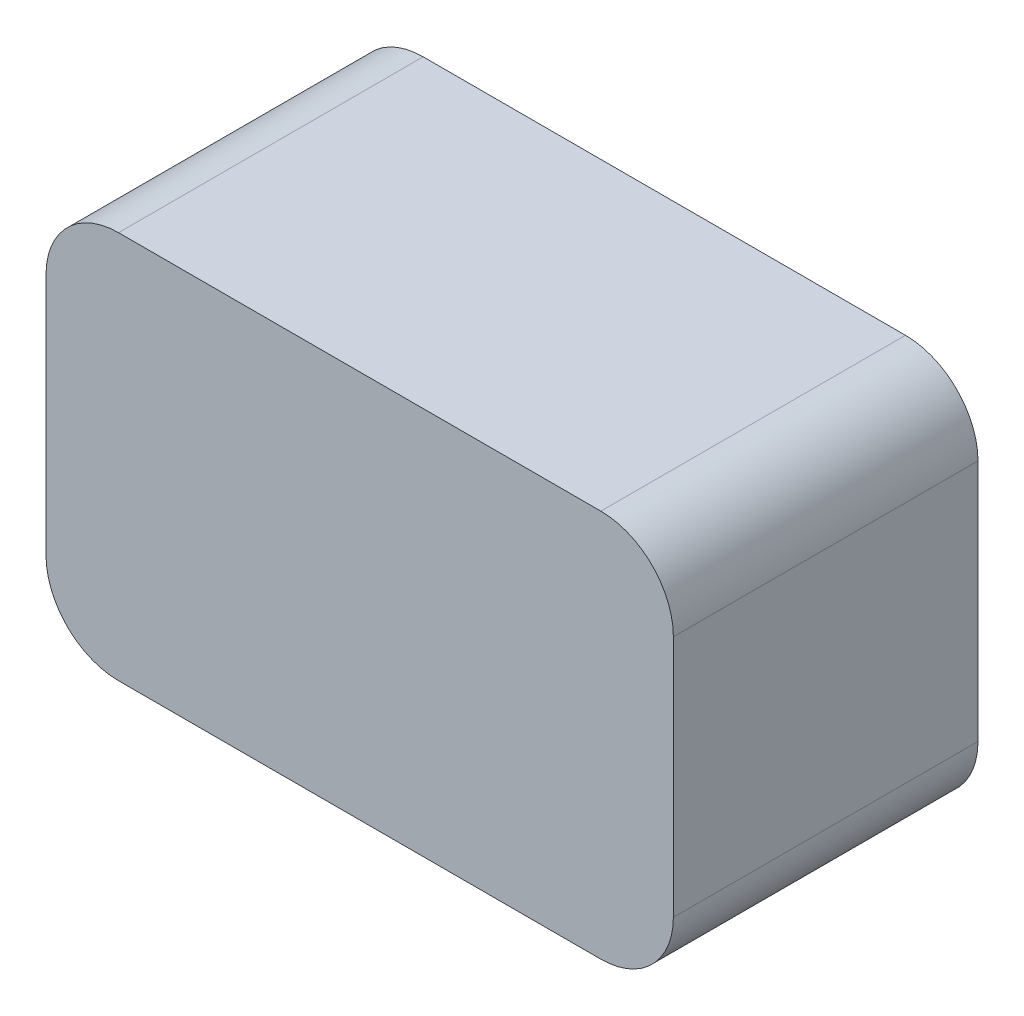
ISO-10303-21;
HEADER;
FILE_DESCRIPTION(('STEP AP214'),'2;1');
FILE_NAME('part.step','',(''),(''),'','','');
FILE_SCHEMA(('AUTOMOTIVE_DESIGN { 1 0 10303 214 1 1 1 1 }'));
ENDSEC;
DATA;
#1=APPLICATION_CONTEXT('core data for automotive mechanical design processes');
#2=APPLICATION_PROTOCOL_DEFINITION('international standard','automotive_design',2000,#1);
#3=PRODUCT_CONTEXT('',#1,'mechanical');
#4=PRODUCT('Part','Part','',(#3));
#5=PRODUCT_RELATED_PRODUCT_CATEGORY('part','',(#4));
#6=PRODUCT_DEFINITION_FORMATION('','',#4);
#7=PRODUCT_DEFINITION_CONTEXT('part definition',#1,'design');
#8=PRODUCT_DEFINITION('design','',#6,#7);
#9=PRODUCT_DEFINITION_SHAPE('','',#8);
#10=(LENGTH_UNIT() NAMED_UNIT(*) SI_UNIT(.MILLI.,.METRE.));
#11=(NAMED_UNIT(*) PLANE_ANGLE_UNIT() SI_UNIT($,.RADIAN.));
#12=(NAMED_UNIT(*) SI_UNIT($,.STERADIAN.) SOLID_ANGLE_UNIT());
#13=UNCERTAINTY_MEASURE_WITH_UNIT(LENGTH_MEASURE(1.E-05),#10,'distance_accuracy_value','');
#14=(GEOMETRIC_REPRESENTATION_CONTEXT(3) GLOBAL_UNCERTAINTY_ASSIGNED_CONTEXT((#13)) GLOBAL_UNIT_ASSIGNED_CONTEXT((#10,
#11,#12)) REPRESENTATION_CONTEXT('',''));
#15=CARTESIAN_POINT('',(0.,0.,0.));
#16=DIRECTION('',(0.,0.,1.));
#17=DIRECTION('',(1.,0.,0.));
#18=AXIS2_PLACEMENT_3D('',#15,#16,#17);
#19=CARTESIAN_POINT('',(24.2648990490756,5.42907303370787,42.));
#20=DIRECTION('',(0.,0.,-1.));
#21=DIRECTION('',(-1.,0.,0.));
#22=AXIS2_PLACEMENT_3D('',#19,#20,#21);
#23=CYLINDRICAL_SURFACE('',#22,10.);
#24=CARTESIAN_POINT('',(24.2648990490756,5.42907303370787,0.));
#25=DIRECTION('',(0.,0.,1.));
#26=DIRECTION('',(-1.,0.,0.));
#27=AXIS2_PLACEMENT_3D('',#24,#25,#26);
#28=CIRCLE('',#27,10.);
#29=CARTESIAN_POINT('',(34.2648990490756,5.4290730337078,0.));
#30=VERTEX_POINT('',#29);
#31=CARTESIAN_POINT('',(24.2648990490755,15.4290730337079,0.));
#32=VERTEX_POINT('',#31);
#33=EDGE_CURVE('E148',#30,#32,#28,.T.);
#34=ORIENTED_EDGE('',*,*,#33,.T.);
#35=DIRECTION('',(0.,0.,-1.));
#36=VECTOR('',#35,1.);
#37=CARTESIAN_POINT('',(24.2648990490755,15.4290730337079,42.));
#38=LINE('',#37,#36);
#39=CARTESIAN_POINT('',(24.2648990490755,15.4290730337079,42.));
#40=VERTEX_POINT('',#39);
#41=EDGE_CURVE('E11',#40,#32,#38,.T.);
#42=ORIENTED_EDGE('',*,*,#41,.F.);
#43=CARTESIAN_POINT('',(24.2648990490756,5.42907303370787,42.));
#44=DIRECTION('',(0.,0.,1.));
#45=DIRECTION('',(-1.,0.,0.));
#46=AXIS2_PLACEMENT_3D('',#43,#44,#45);
#47=CIRCLE('',#46,10.);
#48=CARTESIAN_POINT('',(34.2648990490756,5.4290730337078,42.));
#49=VERTEX_POINT('',#48);
#50=EDGE_CURVE('E165',#49,#40,#47,.T.);
#51=ORIENTED_EDGE('',*,*,#50,.F.);
#52=DIRECTION('',(0.,0.,-1.));
#53=VECTOR('',#52,1.);
#54=CARTESIAN_POINT('',(34.2648990490756,5.4290730337078,42.));
#55=LINE('',#54,#53);
#56=EDGE_CURVE('E144',#49,#30,#55,.T.);
#57=ORIENTED_EDGE('',*,*,#56,.T.);
#58=EDGE_LOOP('',(#34,#42,#51,#57));
#59=FACE_BOUND('',#58,.T.);
#60=ADVANCED_FACE('F40',(#59),#23,.T.);
#61=CARTESIAN_POINT('',(-42.2351009509243,15.4290730337079,42.));
#62=DIRECTION('',(0.,-1.,0.));
#63=DIRECTION('',(0.,0.,-1.));
#64=AXIS2_PLACEMENT_3D('',#61,#62,#63);
#65=PLANE('',#64);
#66=DIRECTION('',(-1.,0.,0.));
#67=VECTOR('',#66,1.);
#68=CARTESIAN_POINT('',(-42.2351009509243,15.4290730337079,0.));
#69=LINE('',#68,#67);
#70=CARTESIAN_POINT('',(-42.2351009509243,15.4290730337079,0.));
#71=VERTEX_POINT('',#70);
#72=EDGE_CURVE('E151',#32,#71,#69,.T.);
#73=ORIENTED_EDGE('',*,*,#72,.T.);
#74=DIRECTION('',(0.,0.,-1.));
#75=VECTOR('',#74,1.);
#76=CARTESIAN_POINT('',(-42.2351009509243,15.4290730337079,42.));
#77=LINE('',#76,#75);
#78=CARTESIAN_POINT('',(-42.2351009509243,15.4290730337079,42.));
#79=VERTEX_POINT('',#78);
#80=EDGE_CURVE('E49',#79,#71,#77,.T.);
#81=ORIENTED_EDGE('',*,*,#80,.F.);
#82=DIRECTION('',(-1.,0.,0.));
#83=VECTOR('',#82,1.);
#84=CARTESIAN_POINT('',(-42.2351009509243,15.4290730337079,42.));
#85=LINE('',#84,#83);
#86=EDGE_CURVE('E103',#40,#79,#85,.T.);
#87=ORIENTED_EDGE('',*,*,#86,.F.);
#88=ORIENTED_EDGE('',*,*,#41,.T.);
#89=EDGE_LOOP('',(#73,#81,#87,#88));
#90=FACE_BOUND('',#89,.T.);
#91=ADVANCED_FACE('F208',(#90),#65,.F.);
#92=CARTESIAN_POINT('',(-42.2351009509244,5.42907303370787,42.));
#93=DIRECTION('',(0.,0.,-1.));
#94=DIRECTION('',(-1.,0.,0.));
#95=AXIS2_PLACEMENT_3D('',#92,#93,#94);
#96=CYLINDRICAL_SURFACE('',#95,10.);
#97=CARTESIAN_POINT('',(-42.2351009509244,5.42907303370787,0.));
#98=DIRECTION('',(0.,0.,1.));
#99=DIRECTION('',(1.,0.,0.));
#100=AXIS2_PLACEMENT_3D('',#97,#98,#99);
#101=CIRCLE('',#100,10.);
#102=CARTESIAN_POINT('',(-52.2351009509244,5.4290730337078,0.));
#103=VERTEX_POINT('',#102);
#104=EDGE_CURVE('E154',#71,#103,#101,.T.);
#105=ORIENTED_EDGE('',*,*,#104,.T.);
#106=DIRECTION('',(0.,0.,-1.));
#107=VECTOR('',#106,1.);
#108=CARTESIAN_POINT('',(-52.2351009509244,5.4290730337078,42.));
#109=LINE('',#108,#107);
#110=CARTESIAN_POINT('',(-52.2351009509244,5.4290730337078,42.));
#111=VERTEX_POINT('',#110);
#112=EDGE_CURVE('E174',#111,#103,#109,.T.);
#113=ORIENTED_EDGE('',*,*,#112,.F.);
#114=CARTESIAN_POINT('',(-42.2351009509244,5.42907303370787,42.));
#115=DIRECTION('',(0.,0.,1.));
#116=DIRECTION('',(1.,0.,0.));
#117=AXIS2_PLACEMENT_3D('',#114,#115,#116);
#118=CIRCLE('',#117,10.);
#119=EDGE_CURVE('E183',#79,#111,#118,.T.);
#120=ORIENTED_EDGE('',*,*,#119,.F.);
#121=ORIENTED_EDGE('',*,*,#80,.T.);
#122=EDGE_LOOP('',(#105,#113,#120,#121));
#123=FACE_BOUND('',#122,.T.);
#124=ADVANCED_FACE('F181',(#123),#96,.T.);
#125=CARTESIAN_POINT('',(-52.2351009509244,5.4290730337078,42.));
#126=DIRECTION('',(1.,0.,0.));
#127=DIRECTION('',(0.,0.,-1.));
#128=AXIS2_PLACEMENT_3D('',#125,#126,#127);
#129=PLANE('',#128);
#130=DIRECTION('',(0.,-1.,0.));
#131=VECTOR('',#130,1.);
#132=CARTESIAN_POINT('',(-52.2351009509244,5.4290730337078,0.));
#133=LINE('',#132,#131);
#134=CARTESIAN_POINT('',(-52.2351009509244,-28.0709269662921,0.));
#135=VERTEX_POINT('',#134);
#136=EDGE_CURVE('E156',#103,#135,#133,.T.);
#137=ORIENTED_EDGE('',*,*,#136,.T.);
#138=DIRECTION('',(0.,0.,-1.));
#139=VECTOR('',#138,1.);
#140=CARTESIAN_POINT('',(-52.2351009509244,-28.0709269662921,42.));
#141=LINE('',#140,#139);
#142=CARTESIAN_POINT('',(-52.2351009509244,-28.0709269662921,42.));
#143=VERTEX_POINT('',#142);
#144=EDGE_CURVE('E171',#143,#135,#141,.T.);
#145=ORIENTED_EDGE('',*,*,#144,.F.);
#146=DIRECTION('',(0.,-1.,0.));
#147=VECTOR('',#146,1.);
#148=CARTESIAN_POINT('',(-52.2351009509244,5.4290730337078,42.));
#149=LINE('',#148,#147);
#150=EDGE_CURVE('E196',#111,#143,#149,.T.);
#151=ORIENTED_EDGE('',*,*,#150,.F.);
#152=ORIENTED_EDGE('',*,*,#112,.T.);
#153=EDGE_LOOP('',(#137,#145,#151,#152));
#154=FACE_BOUND('',#153,.T.);
#155=ADVANCED_FACE('F191',(#154),#129,.F.);
#156=CARTESIAN_POINT('',(-42.2351009509244,-28.0709269662921,42.));
#157=DIRECTION('',(0.,0.,-1.));
#158=DIRECTION('',(-1.,0.,0.));
#159=AXIS2_PLACEMENT_3D('',#156,#157,#158);
#160=CYLINDRICAL_SURFACE('',#159,10.);
#161=CARTESIAN_POINT('',(-42.2351009509244,-28.0709269662921,0.));
#162=DIRECTION('',(0.,0.,1.));
#163=DIRECTION('',(1.,0.,0.));
#164=AXIS2_PLACEMENT_3D('',#161,#162,#163);
#165=CIRCLE('',#164,10.);
#166=CARTESIAN_POINT('',(-42.2351009509243,-38.0709269662921,0.));
#167=VERTEX_POINT('',#166);
#168=EDGE_CURVE('E158',#135,#167,#165,.T.);
#169=ORIENTED_EDGE('',*,*,#168,.T.);
#170=DIRECTION('',(0.,0.,-1.));
#171=VECTOR('',#170,1.);
#172=CARTESIAN_POINT('',(-42.2351009509243,-38.0709269662921,42.));
#173=LINE('',#172,#171);
#174=CARTESIAN_POINT('',(-42.2351009509243,-38.0709269662921,42.));
#175=VERTEX_POINT('',#174);
#176=EDGE_CURVE('E136',#175,#167,#173,.T.);
#177=ORIENTED_EDGE('',*,*,#176,.F.);
#178=CARTESIAN_POINT('',(-42.2351009509244,-28.0709269662921,42.));
#179=DIRECTION('',(0.,0.,1.));
#180=DIRECTION('',(1.,0.,0.));
#181=AXIS2_PLACEMENT_3D('',#178,#179,#180);
#182=CIRCLE('',#181,10.);
#183=EDGE_CURVE('E125',#143,#175,#182,.T.);
#184=ORIENTED_EDGE('',*,*,#183,.F.);
#185=ORIENTED_EDGE('',*,*,#144,.T.);
#186=EDGE_LOOP('',(#169,#177,#184,#185));
#187=FACE_BOUND('',#186,.T.);
#188=ADVANCED_FACE('F194',(#187),#160,.T.);
#189=CARTESIAN_POINT('',(-42.2351009509243,-38.0709269662921,42.));
#190=DIRECTION('',(0.,1.,0.));
#191=DIRECTION('',(0.,0.,1.));
#192=AXIS2_PLACEMENT_3D('',#189,#190,#191);
#193=PLANE('',#192);
#194=DIRECTION('',(1.,0.,0.));
#195=VECTOR('',#194,1.);
#196=CARTESIAN_POINT('',(-42.2351009509243,-38.0709269662921,0.));
#197=LINE('',#196,#195);
#198=CARTESIAN_POINT('',(24.2648990490755,-38.0709269662921,0.));
#199=VERTEX_POINT('',#198);
#200=EDGE_CURVE('E134',#167,#199,#197,.T.);
#201=ORIENTED_EDGE('',*,*,#200,.T.);
#202=DIRECTION('',(0.,0.,-1.));
#203=VECTOR('',#202,1.);
#204=CARTESIAN_POINT('',(24.2648990490755,-38.0709269662921,42.));
#205=LINE('',#204,#203);
#206=CARTESIAN_POINT('',(24.2648990490755,-38.0709269662921,42.));
#207=VERTEX_POINT('',#206);
#208=EDGE_CURVE('E131',#207,#199,#205,.T.);
#209=ORIENTED_EDGE('',*,*,#208,.F.);
#210=DIRECTION('',(1.,0.,0.));
#211=VECTOR('',#210,1.);
#212=CARTESIAN_POINT('',(-42.2351009509243,-38.0709269662921,42.));
#213=LINE('',#212,#211);
#214=EDGE_CURVE('E119',#175,#207,#213,.T.);
#215=ORIENTED_EDGE('',*,*,#214,.F.);
#216=ORIENTED_EDGE('',*,*,#176,.T.);
#217=EDGE_LOOP('',(#201,#209,#215,#216));
#218=FACE_BOUND('',#217,.T.);
#219=ADVANCED_FACE('F132',(#218),#193,.F.);
#220=CARTESIAN_POINT('',(24.2648990490756,-28.0709269662921,42.));
#221=DIRECTION('',(0.,0.,-1.));
#222=DIRECTION('',(-1.,0.,0.));
#223=AXIS2_PLACEMENT_3D('',#220,#221,#222);
#224=CYLINDRICAL_SURFACE('',#223,10.);
#225=CARTESIAN_POINT('',(24.2648990490756,-28.0709269662921,0.));
#226=DIRECTION('',(0.,0.,1.));
#227=DIRECTION('',(1.,0.,0.));
#228=AXIS2_PLACEMENT_3D('',#225,#226,#227);
#229=CIRCLE('',#228,10.);
#230=CARTESIAN_POINT('',(34.2648990490756,-28.0709269662921,0.));
#231=VERTEX_POINT('',#230);
#232=EDGE_CURVE('E87',#199,#231,#229,.T.);
#233=ORIENTED_EDGE('',*,*,#232,.T.);
#234=DIRECTION('',(0.,0.,-1.));
#235=VECTOR('',#234,1.);
#236=CARTESIAN_POINT('',(34.2648990490756,-28.0709269662921,42.));
#237=LINE('',#236,#235);
#238=CARTESIAN_POINT('',(34.2648990490756,-28.0709269662921,42.));
#239=VERTEX_POINT('',#238);
#240=EDGE_CURVE('E137',#239,#231,#237,.T.);
#241=ORIENTED_EDGE('',*,*,#240,.F.);
#242=CARTESIAN_POINT('',(24.2648990490756,-28.0709269662921,42.));
#243=DIRECTION('',(0.,0.,1.));
#244=DIRECTION('',(1.,0.,0.));
#245=AXIS2_PLACEMENT_3D('',#242,#243,#244);
#246=CIRCLE('',#245,10.);
#247=EDGE_CURVE('E123',#207,#239,#246,.T.);
#248=ORIENTED_EDGE('',*,*,#247,.F.);
#249=ORIENTED_EDGE('',*,*,#208,.T.);
#250=EDGE_LOOP('',(#233,#241,#248,#249));
#251=FACE_BOUND('',#250,.T.);
#252=ADVANCED_FACE('F139',(#251),#224,.T.);
#253=CARTESIAN_POINT('',(34.2648990490756,5.4290730337078,42.));
#254=DIRECTION('',(-1.,0.,0.));
#255=DIRECTION('',(0.,-1.,0.));
#256=AXIS2_PLACEMENT_3D('',#253,#254,#255);
#257=PLANE('',#256);
#258=DIRECTION('',(0.,1.,0.));
#259=VECTOR('',#258,1.);
#260=CARTESIAN_POINT('',(34.2648990490756,5.4290730337078,0.));
#261=LINE('',#260,#259);
#262=EDGE_CURVE('E93',#231,#30,#261,.T.);
#263=ORIENTED_EDGE('',*,*,#262,.T.);
#264=ORIENTED_EDGE('',*,*,#56,.F.);
#265=DIRECTION('',(0.,1.,0.));
#266=VECTOR('',#265,1.);
#267=CARTESIAN_POINT('',(34.2648990490756,5.4290730337078,42.));
#268=LINE('',#267,#266);
#269=EDGE_CURVE('E57',#239,#49,#268,.T.);
#270=ORIENTED_EDGE('',*,*,#269,.F.);
#271=ORIENTED_EDGE('',*,*,#240,.T.);
#272=EDGE_LOOP('',(#263,#264,#270,#271));
#273=FACE_BOUND('',#272,.T.);
#274=ADVANCED_FACE('F224',(#273),#257,.F.);
#275=CARTESIAN_POINT('',(24.2648990490756,5.42907303370787,42.));
#276=DIRECTION('',(0.,0.,-1.));
#277=DIRECTION('',(-1.,0.,0.));
#278=AXIS2_PLACEMENT_3D('',#275,#276,#277);
#279=PLANE('',#278);
#280=ORIENTED_EDGE('',*,*,#50,.T.);
#281=ORIENTED_EDGE('',*,*,#86,.T.);
#282=ORIENTED_EDGE('',*,*,#119,.T.);
#283=ORIENTED_EDGE('',*,*,#150,.T.);
#284=ORIENTED_EDGE('',*,*,#183,.T.);
#285=ORIENTED_EDGE('',*,*,#214,.T.);
#286=ORIENTED_EDGE('',*,*,#247,.T.);
#287=ORIENTED_EDGE('',*,*,#269,.T.);
#288=EDGE_LOOP('',(#280,#281,#282,#283,#284,#285,#286,#287));
#289=FACE_BOUND('',#288,.T.);
#290=ADVANCED_FACE('F121',(#289),#279,.F.);
#291=CARTESIAN_POINT('',(24.2648990490756,5.42907303370787,0.));
#292=DIRECTION('',(0.,0.,-1.));
#293=DIRECTION('',(-1.,0.,0.));
#294=AXIS2_PLACEMENT_3D('',#291,#292,#293);
#295=PLANE('',#294);
#296=ORIENTED_EDGE('',*,*,#33,.F.);
#297=ORIENTED_EDGE('',*,*,#262,.F.);
#298=ORIENTED_EDGE('',*,*,#232,.F.);
#299=ORIENTED_EDGE('',*,*,#200,.F.);
#300=ORIENTED_EDGE('',*,*,#168,.F.);
#301=ORIENTED_EDGE('',*,*,#136,.F.);
#302=ORIENTED_EDGE('',*,*,#104,.F.);
#303=ORIENTED_EDGE('',*,*,#72,.F.);
#304=EDGE_LOOP('',(#296,#297,#298,#299,#300,#301,#302,#303));
#305=FACE_BOUND('',#304,.T.);
#306=ADVANCED_FACE('F187',(#305),#295,.T.);
#307=CLOSED_SHELL('',(#60,#91,#124,#155,#188,#219,#252,#274,#290,#306));
#308=MANIFOLD_SOLID_BREP('B2',#307);
#309=ADVANCED_BREP_SHAPE_REPRESENTATION('',(#18,#308),#14);
#310=SHAPE_DEFINITION_REPRESENTATION(#9,#309);
ENDSEC;
END-ISO-10303-21;
